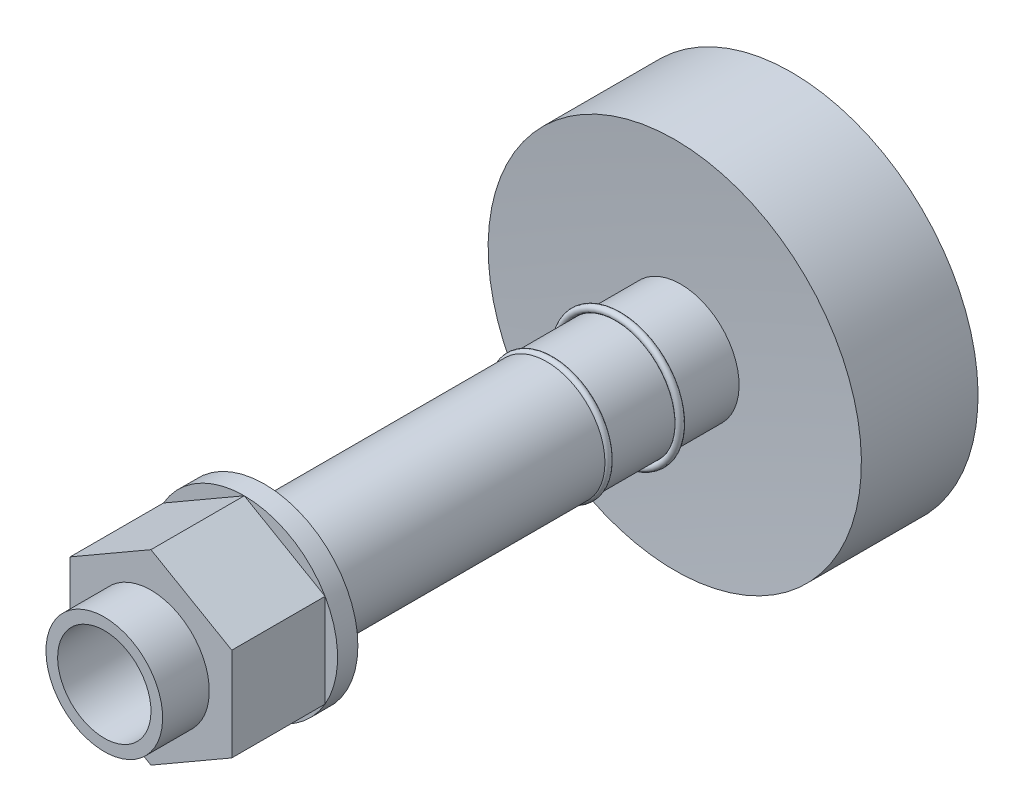
ISO-10303-21;
HEADER;
FILE_DESCRIPTION(('STEP AP214'),'2;1');
FILE_NAME('part.step','',(''),(''),'','','');
FILE_SCHEMA(('AUTOMOTIVE_DESIGN { 1 0 10303 214 1 1 1 1 }'));
ENDSEC;
DATA;
#1=APPLICATION_CONTEXT('core data for automotive mechanical design processes');
#2=APPLICATION_PROTOCOL_DEFINITION('international standard','automotive_design',2000,#1);
#3=PRODUCT_CONTEXT('',#1,'mechanical');
#4=PRODUCT('Part','Part','',(#3));
#5=PRODUCT_RELATED_PRODUCT_CATEGORY('part','',(#4));
#6=PRODUCT_DEFINITION_FORMATION('','',#4);
#7=PRODUCT_DEFINITION_CONTEXT('part definition',#1,'design');
#8=PRODUCT_DEFINITION('design','',#6,#7);
#9=PRODUCT_DEFINITION_SHAPE('','',#8);
#10=(LENGTH_UNIT() NAMED_UNIT(*) SI_UNIT(.MILLI.,.METRE.));
#11=(NAMED_UNIT(*) PLANE_ANGLE_UNIT() SI_UNIT($,.RADIAN.));
#12=(NAMED_UNIT(*) SI_UNIT($,.STERADIAN.) SOLID_ANGLE_UNIT());
#13=UNCERTAINTY_MEASURE_WITH_UNIT(LENGTH_MEASURE(1.E-05),#10,'distance_accuracy_value','');
#14=(GEOMETRIC_REPRESENTATION_CONTEXT(3) GLOBAL_UNCERTAINTY_ASSIGNED_CONTEXT((#13)) GLOBAL_UNIT_ASSIGNED_CONTEXT((#10,
#11,#12)) REPRESENTATION_CONTEXT('',''));
#15=CARTESIAN_POINT('',(0.,0.,0.));
#16=DIRECTION('',(0.,0.,1.));
#17=DIRECTION('',(1.,0.,0.));
#18=AXIS2_PLACEMENT_3D('',#15,#16,#17);
#19=CARTESIAN_POINT('',(0.,0.,92.2495455421056));
#20=DIRECTION('',(0.,0.,-1.));
#21=DIRECTION('',(-1.,0.,0.));
#22=AXIS2_PLACEMENT_3D('',#19,#20,#21);
#23=TOROIDAL_SURFACE('',#22,20.4923443192064,1.4);
#24=CARTESIAN_POINT('',(-21.8923443192064,0.,92.2495455421056));
#25=VERTEX_POINT('',#24);
#26=VERTEX_LOOP('',#25);
#27=FACE_BOUND('',#26,.T.);
#28=ADVANCED_FACE('F40',(#27),#23,.T.);
#29=CLOSED_SHELL('',(#28));
#30=MANIFOLD_SOLID_BREP('B2',#29);
#31=CARTESIAN_POINT('',(0.,0.,77.2647936935371));
#32=DIRECTION('',(0.,0.,-1.));
#33=DIRECTION('',(-1.,0.,0.));
#34=AXIS2_PLACEMENT_3D('',#31,#32,#33);
#35=TOROIDAL_SURFACE('',#34,26.5031584418758,1.4388086219481);
#36=CARTESIAN_POINT('',(-27.9419670638239,0.,77.2647936935371));
#37=VERTEX_POINT('',#36);
#38=VERTEX_LOOP('',#37);
#39=FACE_BOUND('',#38,.T.);
#40=ADVANCED_FACE('F59',(#39),#35,.T.);
#41=CLOSED_SHELL('',(#40));
#42=MANIFOLD_SOLID_BREP('B6',#41);
#43=CARTESIAN_POINT('',(0.,0.,-86.2421074818168));
#44=DIRECTION('',(0.,0.,-1.));
#45=DIRECTION('',(-1.,0.,0.));
#46=AXIS2_PLACEMENT_3D('',#43,#44,#45);
#47=TOROIDAL_SURFACE('',#46,20.4923443192064,1.4);
#48=CARTESIAN_POINT('',(-21.8923443192064,0.,-86.2421074818168));
#49=VERTEX_POINT('',#48);
#50=VERTEX_LOOP('',#49);
#51=FACE_BOUND('',#50,.T.);
#52=ADVANCED_FACE('F78',(#51),#47,.T.);
#53=CLOSED_SHELL('',(#52));
#54=MANIFOLD_SOLID_BREP('B36',#53);
#55=CARTESIAN_POINT('',(0.,0.,-72.5088813841225));
#56=DIRECTION('',(0.,0.,-1.));
#57=DIRECTION('',(-1.,0.,0.));
#58=AXIS2_PLACEMENT_3D('',#55,#56,#57);
#59=TOROIDAL_SURFACE('',#58,26.5031584418758,1.46490910367121);
#60=CARTESIAN_POINT('',(-27.968067545547,0.,-72.5088813841225));
#61=VERTEX_POINT('',#60);
#62=VERTEX_LOOP('',#61);
#63=FACE_BOUND('',#62,.T.);
#64=ADVANCED_FACE('F97',(#63),#59,.T.);
#65=CLOSED_SHELL('',(#64));
#66=MANIFOLD_SOLID_BREP('B55',#65);
#67=CARTESIAN_POINT('',(0.,0.,-43.430612264944));
#68=DIRECTION('',(0.,0.,-1.));
#69=DIRECTION('',(-1.,0.,0.));
#70=AXIS2_PLACEMENT_3D('',#67,#68,#69);
#71=TOROIDAL_SURFACE('',#70,24.5,1.5);
#72=CARTESIAN_POINT('',(-26.,0.,-43.430612264944));
#73=VERTEX_POINT('',#72);
#74=VERTEX_LOOP('',#73);
#75=FACE_BOUND('',#74,.T.);
#76=ADVANCED_FACE('F119',(#75),#71,.T.);
#77=CLOSED_SHELL('',(#76));
#78=MANIFOLD_SOLID_BREP('B74',#77);
#79=CARTESIAN_POINT('',(0.,0.,-146.850396264251));
#80=DIRECTION('',(0.,0.,-1.));
#81=DIRECTION('',(0.,1.,0.));
#82=AXIS2_PLACEMENT_3D('',#79,#80,#81);
#83=CYLINDRICAL_SURFACE('',#82,20.);
#84=CARTESIAN_POINT('',(0.,0.,147.667859857963));
#85=DIRECTION('',(0.,0.,-1.));
#86=DIRECTION('',(0.,1.,0.));
#87=AXIS2_PLACEMENT_3D('',#84,#85,#86);
#88=CIRCLE('',#87,20.);
#89=CARTESIAN_POINT('',(0.,20.,147.667859857963));
#90=VERTEX_POINT('',#89);
#91=EDGE_CURVE('E294',#90,#90,#88,.T.);
#92=ORIENTED_EDGE('',*,*,#91,.F.);
#93=EDGE_LOOP('',(#92));
#94=FACE_BOUND('',#93,.T.);
#95=CARTESIAN_POINT('',(0.,0.,93.7058594382387));
#96=DIRECTION('',(0.,0.,-1.));
#97=DIRECTION('',(-1.,0.,0.));
#98=AXIS2_PLACEMENT_3D('',#95,#96,#97);
#99=CIRCLE('',#98,20.);
#100=CARTESIAN_POINT('',(-20.,0.,93.7058594382387));
#101=VERTEX_POINT('',#100);
#102=EDGE_CURVE('E136',#101,#101,#99,.F.);
#103=ORIENTED_EDGE('',*,*,#102,.F.);
#104=EDGE_LOOP('',(#103));
#105=FACE_BOUND('',#104,.T.);
#106=ADVANCED_FACE('F132',(#94,#105),#83,.F.);
#107=CARTESIAN_POINT('',(0.,0.,-146.850396264251));
#108=DIRECTION('',(0.,0.,-1.));
#109=DIRECTION('',(0.,1.,0.));
#110=AXIS2_PLACEMENT_3D('',#107,#108,#109);
#111=CIRCLE('',#110,20.);
#112=CARTESIAN_POINT('',(0.,20.,-146.850396264251));
#113=VERTEX_POINT('',#112);
#114=EDGE_CURVE('E291',#113,#113,#111,.T.);
#115=ORIENTED_EDGE('',*,*,#114,.T.);
#116=EDGE_LOOP('',(#115));
#117=FACE_BOUND('',#116,.T.);
#118=CARTESIAN_POINT('',(0.,0.,-87.724989526654));
#119=DIRECTION('',(0.,0.,1.));
#120=DIRECTION('',(1.,0.,0.));
#121=AXIS2_PLACEMENT_3D('',#118,#119,#120);
#122=CIRCLE('',#121,20.);
#123=CARTESIAN_POINT('',(20.,0.,-87.724989526654));
#124=VERTEX_POINT('',#123);
#125=EDGE_CURVE('E232',#124,#124,#122,.F.);
#126=ORIENTED_EDGE('',*,*,#125,.F.);
#127=EDGE_LOOP('',(#126));
#128=FACE_BOUND('',#127,.T.);
#129=ADVANCED_FACE('F330',(#117,#128),#83,.F.);
#130=CARTESIAN_POINT('',(0.,0.,-146.850396264251));
#131=DIRECTION('',(0.,0.,-1.));
#132=DIRECTION('',(0.,1.,0.));
#133=AXIS2_PLACEMENT_3D('',#130,#131,#132);
#134=CYLINDRICAL_SURFACE('',#133,40.);
#135=CARTESIAN_POINT('',(0.,0.,78.9651780162435));
#136=DIRECTION('',(0.,0.,-1.));
#137=DIRECTION('',(0.,1.,0.));
#138=AXIS2_PLACEMENT_3D('',#135,#136,#137);
#139=CIRCLE('',#138,40.);
#140=CARTESIAN_POINT('',(0.,40.,78.9651780162435));
#141=VERTEX_POINT('',#140);
#142=EDGE_CURVE('E302',#141,#141,#139,.T.);
#143=ORIENTED_EDGE('',*,*,#142,.F.);
#144=EDGE_LOOP('',(#143));
#145=FACE_BOUND('',#144,.T.);
#146=CARTESIAN_POINT('',(0.,0.,87.6678598579632));
#147=DIRECTION('',(0.,0.,1.));
#148=DIRECTION('',(1.,0.,0.));
#149=AXIS2_PLACEMENT_3D('',#146,#147,#148);
#150=CIRCLE('',#149,40.);
#151=CARTESIAN_POINT('',(34.6410161513775,20.,87.6678598579632));
#152=VERTEX_POINT('',#151);
#153=CARTESIAN_POINT('',(0.,39.9999999999999,87.6678598579632));
#154=VERTEX_POINT('',#153);
#155=EDGE_CURVE('E117',#152,#154,#150,.T.);
#156=ORIENTED_EDGE('',*,*,#155,.F.);
#157=CARTESIAN_POINT('',(34.6410161513775,-19.9999999999999,87.6678598579632));
#158=VERTEX_POINT('',#157);
#159=EDGE_CURVE('E143',#158,#152,#150,.T.);
#160=ORIENTED_EDGE('',*,*,#159,.F.);
#161=CARTESIAN_POINT('',(0.,-40.,87.6678598579632));
#162=VERTEX_POINT('',#161);
#163=EDGE_CURVE('E224',#162,#158,#150,.T.);
#164=ORIENTED_EDGE('',*,*,#163,.F.);
#165=CARTESIAN_POINT('',(-34.6410161513775,-20.,87.6678598579632));
#166=VERTEX_POINT('',#165);
#167=EDGE_CURVE('E221',#166,#162,#150,.T.);
#168=ORIENTED_EDGE('',*,*,#167,.F.);
#169=CARTESIAN_POINT('',(-34.6410161513775,19.9999999999999,87.6678598579632));
#170=VERTEX_POINT('',#169);
#171=EDGE_CURVE('E220',#170,#166,#150,.T.);
#172=ORIENTED_EDGE('',*,*,#171,.F.);
#173=EDGE_CURVE('E141',#154,#170,#150,.T.);
#174=ORIENTED_EDGE('',*,*,#173,.F.);
#175=EDGE_LOOP('',(#156,#160,#164,#168,#172,#174));
#176=FACE_BOUND('',#175,.T.);
#177=ADVANCED_FACE('F218',(#145,#176),#134,.T.);
#178=CARTESIAN_POINT('',(0.,0.,127.667859857963));
#179=DIRECTION('',(0.,0.,-1.));
#180=DIRECTION('',(0.,1.,0.));
#181=AXIS2_PLACEMENT_3D('',#178,#179,#180);
#182=PLANE('',#181);
#183=CARTESIAN_POINT('',(0.,0.,127.667859857963));
#184=DIRECTION('',(0.,0.,-1.));
#185=DIRECTION('',(0.,1.,0.));
#186=AXIS2_PLACEMENT_3D('',#183,#184,#185);
#187=CIRCLE('',#186,25.);
#188=CARTESIAN_POINT('',(0.,25.,127.667859857963));
#189=VERTEX_POINT('',#188);
#190=EDGE_CURVE('E300',#189,#189,#187,.T.);
#191=ORIENTED_EDGE('',*,*,#190,.T.);
#192=EDGE_LOOP('',(#191));
#193=FACE_BOUND('',#192,.T.);
#194=DIRECTION('',(0.866025403784438,0.500000000000001,0.));
#195=VECTOR('',#194,1.);
#196=CARTESIAN_POINT('',(0.,-40.,127.667859857963));
#197=LINE('',#196,#195);
#198=CARTESIAN_POINT('',(0.,-40.,127.667859857963));
#199=VERTEX_POINT('',#198);
#200=CARTESIAN_POINT('',(34.6410161513775,-19.9999999999999,127.667859857963));
#201=VERTEX_POINT('',#200);
#202=EDGE_CURVE('E230',#199,#201,#197,.T.);
#203=ORIENTED_EDGE('',*,*,#202,.T.);
#204=DIRECTION('',(0.,1.,0.));
#205=VECTOR('',#204,1.);
#206=CARTESIAN_POINT('',(34.6410161513775,-19.9999999999999,127.667859857963));
#207=LINE('',#206,#205);
#208=CARTESIAN_POINT('',(34.6410161513775,20.0000000000001,127.667859857963));
#209=VERTEX_POINT('',#208);
#210=EDGE_CURVE('E268',#201,#209,#207,.T.);
#211=ORIENTED_EDGE('',*,*,#210,.T.);
#212=DIRECTION('',(-0.866025403784439,0.499999999999999,0.));
#213=VECTOR('',#212,1.);
#214=CARTESIAN_POINT('',(34.6410161513775,20.,127.667859857963));
#215=LINE('',#214,#213);
#216=CARTESIAN_POINT('',(0.,39.9999999999999,127.667859857963));
#217=VERTEX_POINT('',#216);
#218=EDGE_CURVE('E158',#209,#217,#215,.T.);
#219=ORIENTED_EDGE('',*,*,#218,.T.);
#220=DIRECTION('',(-0.866025403784438,-0.500000000000001,0.));
#221=VECTOR('',#220,1.);
#222=CARTESIAN_POINT('',(0.,39.9999999999999,127.667859857963));
#223=LINE('',#222,#221);
#224=CARTESIAN_POINT('',(-34.6410161513775,19.9999999999999,127.667859857963));
#225=VERTEX_POINT('',#224);
#226=EDGE_CURVE('E205',#217,#225,#223,.T.);
#227=ORIENTED_EDGE('',*,*,#226,.T.);
#228=DIRECTION('',(0.,-1.,0.));
#229=VECTOR('',#228,1.);
#230=CARTESIAN_POINT('',(-34.6410161513775,19.9999999999999,127.667859857963));
#231=LINE('',#230,#229);
#232=CARTESIAN_POINT('',(-34.6410161513775,-20.,127.667859857963));
#233=VERTEX_POINT('',#232);
#234=EDGE_CURVE('E273',#225,#233,#231,.T.);
#235=ORIENTED_EDGE('',*,*,#234,.T.);
#236=DIRECTION('',(0.866025403784439,-0.499999999999999,0.));
#237=VECTOR('',#236,1.);
#238=CARTESIAN_POINT('',(-34.6410161513775,-20.,127.667859857963));
#239=LINE('',#238,#237);
#240=EDGE_CURVE('E258',#233,#199,#239,.T.);
#241=ORIENTED_EDGE('',*,*,#240,.T.);
#242=EDGE_LOOP('',(#203,#211,#219,#227,#235,#241));
#243=FACE_BOUND('',#242,.T.);
#244=ADVANCED_FACE('F322',(#193,#243),#182,.F.);
#245=CARTESIAN_POINT('',(0.,0.,1020.28880723726));
#246=DIRECTION('',(0.,0.,-1.));
#247=DIRECTION('',(0.,1.,0.));
#248=AXIS2_PLACEMENT_3D('',#245,#246,#247);
#249=SPHERICAL_SURFACE('',#248,1120.);
#250=CARTESIAN_POINT('',(0.,0.,-96.8503962642506));
#251=DIRECTION('',(0.,0.,-1.));
#252=DIRECTION('',(0.,1.,0.));
#253=AXIS2_PLACEMENT_3D('',#250,#251,#252);
#254=CIRCLE('',#253,80.);
#255=CARTESIAN_POINT('',(0.,80.0000000000026,-96.8503962642506));
#256=VERTEX_POINT('',#255);
#257=EDGE_CURVE('E280',#256,#256,#254,.T.);
#258=CARTESIAN_POINT('',(0.,0.,-99.4321401420368));
#259=DIRECTION('',(0.,0.,-1.));
#260=DIRECTION('',(0.,1.,0.));
#261=AXIS2_PLACEMENT_3D('',#258,#259,#260);
#262=CIRCLE('',#261,25.);
#263=CARTESIAN_POINT('',(0.,24.9999999999982,-99.4321401420368));
#264=VERTEX_POINT('',#263);
#265=EDGE_CURVE('E225',#264,#264,#262,.T.);
#266=CARTESIAN_POINT('',(0.,80.0000000000026,-96.8503962642506));
#267=CARTESIAN_POINT('',(0.,79.427859864808,-96.8913680707098));
#268=CARTESIAN_POINT('',(0.,78.8556882541452,-96.931900346162));
#269=CARTESIAN_POINT('',(0.,77.7112834326982,-97.0120857410063));
#270=CARTESIAN_POINT('',(0.,77.139050221914,-97.0517388603985));
#271=CARTESIAN_POINT('',(0.,75.9945235510389,-97.1301658490768));
#272=CARTESIAN_POINT('',(0.,75.422230090948,-97.168939718363));
#273=CARTESIAN_POINT('',(0.,74.277584272456,-97.245608115415));
#274=CARTESIAN_POINT('',(0.,73.7052319140548,-97.2835026431808));
#275=CARTESIAN_POINT('',(0.,72.5604696500667,-97.3584122677048));
#276=CARTESIAN_POINT('',(0.,71.9880597444798,-97.3954273644631));
#277=CARTESIAN_POINT('',(0.,70.8431837373836,-97.4685780396003));
#278=CARTESIAN_POINT('',(0.,70.2707176358743,-97.5047136179792));
#279=CARTESIAN_POINT('',(0.,69.1257305883287,-97.576105171052));
#280=CARTESIAN_POINT('',(0.,68.5532096422922,-97.6113611457458));
#281=CARTESIAN_POINT('',(0.,67.4081142572172,-97.6809934082219));
#282=CARTESIAN_POINT('',(0.,66.8355398181785,-97.7153696960042));
#283=CARTESIAN_POINT('',(0.,65.6903387987503,-97.7832425035062));
#284=CARTESIAN_POINT('',(0.,65.1177122183607,-97.8167390232259));
#285=CARTESIAN_POINT('',(0.,63.9724082680047,-97.8828522155293));
#286=CARTESIAN_POINT('',(0.,63.3997308980383,-97.9154688881129));
#287=CARTESIAN_POINT('',(0.,62.254326720423,-97.9798223091473));
#288=CARTESIAN_POINT('',(0.,61.681599912774,-98.0115590575981));
#289=CARTESIAN_POINT('',(0.,60.5360982118043,-98.0741525554469));
#290=CARTESIAN_POINT('',(0.,59.9633233184835,-98.1050093048451));
#291=CARTESIAN_POINT('',(0.,58.8177267982946,-98.165842731747));
#292=CARTESIAN_POINT('',(0.,58.2449051714265,-98.1958194092508));
#293=CARTESIAN_POINT('',(0.,57.0992165363774,-98.254892621599));
#294=CARTESIAN_POINT('',(0.,56.5263495281965,-98.2839891564434));
#295=CARTESIAN_POINT('',(0.,55.3805714828638,-98.341302014786));
#296=CARTESIAN_POINT('',(0.,54.8076604457121,-98.3695183382844));
#297=CARTESIAN_POINT('',(0.,53.6617956948836,-98.4250707073258));
#298=CARTESIAN_POINT('',(0.,53.0888419812067,-98.452406752869));
#299=CARTESIAN_POINT('',(0.,51.9428932298744,-98.5061985014692));
#300=CARTESIAN_POINT('',(0.,51.3698981922189,-98.5326542045262));
#301=CARTESIAN_POINT('',(0.,50.2238681455735,-98.5846852057012));
#302=CARTESIAN_POINT('',(0.,49.6508331365834,-98.6102605038192));
#303=CARTESIAN_POINT('',(0.,48.5047245000072,-98.6605306347418));
#304=CARTESIAN_POINT('',(0.,47.9316508724209,-98.6852254675465));
#305=CARTESIAN_POINT('',(0.,46.7854663514819,-98.7337346095463));
#306=CARTESIAN_POINT('',(0.,46.2123554581292,-98.7575489187414));
#307=CARTESIAN_POINT('',(0.,45.0660977585747,-98.804296957305));
#308=CARTESIAN_POINT('',(0.,44.4929509523729,-98.8272306866735));
#309=CARTESIAN_POINT('',(0.,43.3466227801227,-98.8722175114448));
#310=CARTESIAN_POINT('',(0.,42.7734414140742,-98.8942706068476));
#311=CARTESIAN_POINT('',(0.,41.6270454752145,-98.9374961116281));
#312=CARTESIAN_POINT('',(0.,41.0538309024033,-98.9586685210058));
#313=CARTESIAN_POINT('',(0.,39.9073699031803,-99.0001326037552));
#314=CARTESIAN_POINT('',(0.,39.3341234767686,-99.0204242771268));
#315=CARTESIAN_POINT('',(0.,38.1876001235821,-99.0601268399625));
#316=CARTESIAN_POINT('',(0.,37.6143231968074,-99.0795377294266));
#317=CARTESIAN_POINT('',(0.,36.4677401962044,-99.1174786786247));
#318=CARTESIAN_POINT('',(0.,35.8944341223762,-99.1360087383587));
#319=CARTESIAN_POINT('',(0.,34.7477941810447,-99.1721879843531));
#320=CARTESIAN_POINT('',(0.,34.1744603135413,-99.1898371706136));
#321=CARTESIAN_POINT('',(0.,33.0277661383034,-99.2242546279992));
#322=CARTESIAN_POINT('',(0.,32.4544058305688,-99.2410228991245));
#323=CARTESIAN_POINT('',(0.,31.3076601283745,-99.2736784866475));
#324=CARTESIAN_POINT('',(0.,30.7342747339149,-99.2895658030453));
#325=CARTESIAN_POINT('',(0.,29.5874802118366,-99.3204594436403));
#326=CARTESIAN_POINT('',(0.,29.0140710842181,-99.3354657678376));
#327=CARTESIAN_POINT('',(0.,27.8672304494411,-99.3645973884889));
#328=CARTESIAN_POINT('',(0.,27.2937989422826,-99.3787226849428));
#329=CARTESIAN_POINT('',(0.,26.1469149021105,-99.4060922172024));
#330=CARTESIAN_POINT('',(0.,25.5734623690969,-99.4193364530079));
#331=CARTESIAN_POINT('',(0.,24.9999999999982,-99.4321401420368));
#332=B_SPLINE_CURVE_WITH_KNOTS('',3,(#266,#267,#268,#269,#270,#271,#272,#273,#274,#275,#276,
#277,#278,#279,#280,#281,#282,#283,#284,#285,#286,#287,#288,#289,#290,#291,#292,#293,#294,#295,
#296,#297,#298,#299,#300,#301,#302,#303,#304,#305,#306,#307,#308,#309,#310,#311,#312,#313,#314,
#315,#316,#317,#318,#319,#320,#321,#322,#323,#324,#325,#326,#327,#328,#329,#330,#331),
.UNSPECIFIED.,.F.,.F.,(4,2,2,2,2,2,2,2,2,2,2,2,2,2,2,2,2,2,2,2,2,2,2,2,2,2,2,2,2,2,2,2,4),(0.,
1.72081568637867,3.44163137275737,5.16244705913633,6.88326274551501,8.60407843189372,
10.3248941182724,12.0457098046511,13.76652549103,15.4873411774087,17.2081568637874,
18.9289725501661,20.6497882365448,22.3706039229235,24.0914196093025,25.8122352956812,
27.5330509820599,29.2538666684386,30.9746823548172,32.6954980411962,34.4163137275749,
36.1371294139536,37.8579451003323,39.578760786711,41.2995764730897,43.0203921594686,
44.7412078458473,46.462023532226,48.1828392186047,49.9036549049834,51.6244705913623,
53.345286277741,55.0661019641197),.UNSPECIFIED.);
#333=EDGE_CURVE('BSEAM134',#256,#264,#332,.T.);
#334=ORIENTED_EDGE('',*,*,#257,.F.);
#335=ORIENTED_EDGE('',*,*,#265,.T.);
#336=ORIENTED_EDGE('',*,*,#333,.T.);
#337=ORIENTED_EDGE('',*,*,#333,.F.);
#338=EDGE_LOOP('',(#334,#336,#335,#337));
#339=FACE_BOUND('',#338,.T.);
#340=ADVANCED_FACE('F134',(#339),#249,.F.);
#341=CARTESIAN_POINT('',(0.,0.,-146.850396264251));
#342=DIRECTION('',(0.,0.,-1.));
#343=DIRECTION('',(0.,1.,0.));
#344=AXIS2_PLACEMENT_3D('',#341,#342,#343);
#345=CYLINDRICAL_SURFACE('',#344,25.);
#346=CARTESIAN_POINT('',(0.,0.,-44.930612264944));
#347=DIRECTION('',(0.,0.,1.));
#348=DIRECTION('',(1.,0.,0.));
#349=AXIS2_PLACEMENT_3D('',#346,#347,#348);
#350=CIRCLE('',#349,25.);
#351=CARTESIAN_POINT('',(25.,0.,-44.930612264944));
#352=VERTEX_POINT('',#351);
#353=EDGE_CURVE('E252',#352,#352,#350,.T.);
#354=ORIENTED_EDGE('',*,*,#353,.F.);
#355=EDGE_LOOP('',(#354));
#356=FACE_BOUND('',#355,.T.);
#357=ORIENTED_EDGE('',*,*,#265,.F.);
#358=EDGE_LOOP('',(#357));
#359=FACE_BOUND('',#358,.T.);
#360=ADVANCED_FACE('F310',(#356,#359),#345,.T.);
#361=CARTESIAN_POINT('',(0.,0.,1017.67972247987));
#362=DIRECTION('',(0.,0.,-1.));
#363=DIRECTION('',(0.,1.,0.));
#364=AXIS2_PLACEMENT_3D('',#361,#362,#363);
#365=DEGENERATE_TOROIDAL_SURFACE('',#364,48.7435294117576,942.9,.F.);
#366=CARTESIAN_POINT('',(0.,0.,77.9080264316032));
#367=DIRECTION('',(0.,0.,1.));
#368=DIRECTION('',(0.,-1.,0.));
#369=AXIS2_PLACEMENT_3D('',#366,#367,#368);
#370=CIRCLE('',#369,28.);
#371=CARTESIAN_POINT('',(0.,-28.,77.9080264316032));
#372=VERTEX_POINT('',#371);
#373=EDGE_CURVE('E227',#372,#372,#370,.F.);
#374=ORIENTED_EDGE('',*,*,#373,.F.);
#375=EDGE_LOOP('',(#374));
#376=FACE_BOUND('',#375,.T.);
#377=ORIENTED_EDGE('',*,*,#142,.T.);
#378=EDGE_LOOP('',(#377));
#379=FACE_BOUND('',#378,.T.);
#380=ADVANCED_FACE('F312',(#376,#379),#365,.F.);
#381=CARTESIAN_POINT('',(0.,0.,-146.850396264251));
#382=DIRECTION('',(0.,0.,-1.));
#383=DIRECTION('',(0.,1.,0.));
#384=AXIS2_PLACEMENT_3D('',#381,#382,#383);
#385=CYLINDRICAL_SURFACE('',#384,25.);
#386=CARTESIAN_POINT('',(0.,0.,147.667859857963));
#387=DIRECTION('',(0.,0.,-1.));
#388=DIRECTION('',(0.,1.,0.));
#389=AXIS2_PLACEMENT_3D('',#386,#387,#388);
#390=CIRCLE('',#389,25.);
#391=CARTESIAN_POINT('',(0.,25.,147.667859857963));
#392=VERTEX_POINT('',#391);
#393=EDGE_CURVE('E297',#392,#392,#390,.T.);
#394=ORIENTED_EDGE('',*,*,#393,.T.);
#395=EDGE_LOOP('',(#394));
#396=FACE_BOUND('',#395,.T.);
#397=ORIENTED_EDGE('',*,*,#190,.F.);
#398=EDGE_LOOP('',(#397));
#399=FACE_BOUND('',#398,.T.);
#400=ADVANCED_FACE('F319',(#396,#399),#385,.T.);
#401=CARTESIAN_POINT('',(0.,0.,147.667859857963));
#402=DIRECTION('',(0.,0.,1.));
#403=DIRECTION('',(0.,-1.,0.));
#404=AXIS2_PLACEMENT_3D('',#401,#402,#403);
#405=PLANE('',#404);
#406=ORIENTED_EDGE('',*,*,#91,.T.);
#407=EDGE_LOOP('',(#406));
#408=FACE_BOUND('',#407,.T.);
#409=ORIENTED_EDGE('',*,*,#393,.F.);
#410=EDGE_LOOP('',(#409));
#411=FACE_BOUND('',#410,.T.);
#412=ADVANCED_FACE('F415',(#408,#411),#405,.T.);
#413=CARTESIAN_POINT('',(0.,1.35863909256583E-13,-146.850396264251));
#414=DIRECTION('',(0.,0.,1.));
#415=DIRECTION('',(0.,-1.,0.));
#416=AXIS2_PLACEMENT_3D('',#413,#414,#415);
#417=PLANE('',#416);
#418=ORIENTED_EDGE('',*,*,#114,.F.);
#419=EDGE_LOOP('',(#418));
#420=FACE_BOUND('',#419,.T.);
#421=CARTESIAN_POINT('',(0.,0.,-146.850396264251));
#422=DIRECTION('',(0.,0.,-1.));
#423=DIRECTION('',(0.,1.,0.));
#424=AXIS2_PLACEMENT_3D('',#421,#422,#423);
#425=CIRCLE('',#424,80.);
#426=CARTESIAN_POINT('',(0.,80.,-146.850396264251));
#427=VERTEX_POINT('',#426);
#428=EDGE_CURVE('E288',#427,#427,#425,.T.);
#429=ORIENTED_EDGE('',*,*,#428,.T.);
#430=EDGE_LOOP('',(#429));
#431=FACE_BOUND('',#430,.T.);
#432=ADVANCED_FACE('F412',(#420,#431),#417,.F.);
#433=CARTESIAN_POINT('',(0.,0.,-146.850396264251));
#434=DIRECTION('',(0.,0.,-1.));
#435=DIRECTION('',(0.,1.,0.));
#436=AXIS2_PLACEMENT_3D('',#433,#434,#435);
#437=CYLINDRICAL_SURFACE('',#436,80.);
#438=ORIENTED_EDGE('',*,*,#428,.F.);
#439=EDGE_LOOP('',(#438));
#440=FACE_BOUND('',#439,.T.);
#441=ORIENTED_EDGE('',*,*,#257,.T.);
#442=EDGE_LOOP('',(#441));
#443=FACE_BOUND('',#442,.T.);
#444=ADVANCED_FACE('F410',(#440,#443),#437,.T.);
#445=CARTESIAN_POINT('',(0.,0.,87.6678598579632));
#446=DIRECTION('',(0.,0.,1.));
#447=DIRECTION('',(1.,0.,0.));
#448=AXIS2_PLACEMENT_3D('',#445,#446,#447);
#449=PLANE('',#448);
#450=ORIENTED_EDGE('',*,*,#155,.T.);
#451=DIRECTION('',(-0.866025403784439,0.499999999999999,0.));
#452=VECTOR('',#451,1.);
#453=CARTESIAN_POINT('',(34.6410161513775,20.,87.6678598579632));
#454=LINE('',#453,#452);
#455=EDGE_CURVE('E192',#152,#154,#454,.T.);
#456=ORIENTED_EDGE('',*,*,#455,.F.);
#457=EDGE_LOOP('',(#450,#456));
#458=FACE_BOUND('',#457,.T.);
#459=ADVANCED_FACE('F190',(#458),#449,.T.);
#460=ORIENTED_EDGE('',*,*,#173,.T.);
#461=DIRECTION('',(-0.866025403784438,-0.500000000000001,0.));
#462=VECTOR('',#461,1.);
#463=CARTESIAN_POINT('',(0.,39.9999999999999,87.6678598579632));
#464=LINE('',#463,#462);
#465=EDGE_CURVE('E202',#154,#170,#464,.T.);
#466=ORIENTED_EDGE('',*,*,#465,.F.);
#467=EDGE_LOOP('',(#460,#466));
#468=FACE_BOUND('',#467,.T.);
#469=ADVANCED_FACE('F210',(#468),#449,.T.);
#470=ORIENTED_EDGE('',*,*,#171,.T.);
#471=DIRECTION('',(0.,-1.,0.));
#472=VECTOR('',#471,1.);
#473=CARTESIAN_POINT('',(-34.6410161513775,19.9999999999999,87.6678598579632));
#474=LINE('',#473,#472);
#475=EDGE_CURVE('E212',#170,#166,#474,.T.);
#476=ORIENTED_EDGE('',*,*,#475,.F.);
#477=EDGE_LOOP('',(#470,#476));
#478=FACE_BOUND('',#477,.T.);
#479=ADVANCED_FACE('F487',(#478),#449,.T.);
#480=ORIENTED_EDGE('',*,*,#167,.T.);
#481=DIRECTION('',(0.866025403784439,-0.499999999999999,0.));
#482=VECTOR('',#481,1.);
#483=CARTESIAN_POINT('',(-34.6410161513775,-20.,87.6678598579632));
#484=LINE('',#483,#482);
#485=EDGE_CURVE('E262',#166,#162,#484,.T.);
#486=ORIENTED_EDGE('',*,*,#485,.F.);
#487=EDGE_LOOP('',(#480,#486));
#488=FACE_BOUND('',#487,.T.);
#489=ADVANCED_FACE('F493',(#488),#449,.T.);
#490=ORIENTED_EDGE('',*,*,#163,.T.);
#491=DIRECTION('',(0.866025403784438,0.500000000000001,0.));
#492=VECTOR('',#491,1.);
#493=CARTESIAN_POINT('',(0.,-40.,87.6678598579632));
#494=LINE('',#493,#492);
#495=EDGE_CURVE('E150',#162,#158,#494,.T.);
#496=ORIENTED_EDGE('',*,*,#495,.F.);
#497=EDGE_LOOP('',(#490,#496));
#498=FACE_BOUND('',#497,.T.);
#499=ADVANCED_FACE('F500',(#498),#449,.T.);
#500=ORIENTED_EDGE('',*,*,#159,.T.);
#501=DIRECTION('',(0.,1.,0.));
#502=VECTOR('',#501,1.);
#503=CARTESIAN_POINT('',(34.6410161513775,-19.9999999999999,87.6678598579632));
#504=LINE('',#503,#502);
#505=EDGE_CURVE('E216',#158,#152,#504,.T.);
#506=ORIENTED_EDGE('',*,*,#505,.F.);
#507=EDGE_LOOP('',(#500,#506));
#508=FACE_BOUND('',#507,.T.);
#509=ADVANCED_FACE('F407',(#508),#449,.T.);
#510=CARTESIAN_POINT('',(0.,-40.,87.6678598579632));
#511=DIRECTION('',(0.500000000000001,-0.866025403784438,0.));
#512=DIRECTION('',(0.866025403784438,0.500000000000001,0.));
#513=AXIS2_PLACEMENT_3D('',#510,#511,#512);
#514=PLANE('',#513);
#515=ORIENTED_EDGE('',*,*,#202,.F.);
#516=DIRECTION('',(0.,0.,1.));
#517=VECTOR('',#516,1.);
#518=CARTESIAN_POINT('',(0.,-40.,87.6678598579632));
#519=LINE('',#518,#517);
#520=EDGE_CURVE('E278',#162,#199,#519,.T.);
#521=ORIENTED_EDGE('',*,*,#520,.F.);
#522=ORIENTED_EDGE('',*,*,#495,.T.);
#523=DIRECTION('',(0.,0.,1.));
#524=VECTOR('',#523,1.);
#525=CARTESIAN_POINT('',(34.6410161513775,-19.9999999999999,87.6678598579632));
#526=LINE('',#525,#524);
#527=EDGE_CURVE('E265',#158,#201,#526,.T.);
#528=ORIENTED_EDGE('',*,*,#527,.T.);
#529=EDGE_LOOP('',(#515,#521,#522,#528));
#530=FACE_BOUND('',#529,.T.);
#531=ADVANCED_FACE('F393',(#530),#514,.T.);
#532=CARTESIAN_POINT('',(-34.6410161513775,-20.,87.6678598579632));
#533=DIRECTION('',(-0.499999999999999,-0.866025403784439,0.));
#534=DIRECTION('',(0.866025403784439,-0.499999999999999,0.));
#535=AXIS2_PLACEMENT_3D('',#532,#533,#534);
#536=PLANE('',#535);
#537=ORIENTED_EDGE('',*,*,#240,.F.);
#538=DIRECTION('',(0.,0.,1.));
#539=VECTOR('',#538,1.);
#540=CARTESIAN_POINT('',(-34.6410161513775,-20.,87.6678598579632));
#541=LINE('',#540,#539);
#542=EDGE_CURVE('E281',#166,#233,#541,.T.);
#543=ORIENTED_EDGE('',*,*,#542,.F.);
#544=ORIENTED_EDGE('',*,*,#485,.T.);
#545=ORIENTED_EDGE('',*,*,#520,.T.);
#546=EDGE_LOOP('',(#537,#543,#544,#545));
#547=FACE_BOUND('',#546,.T.);
#548=ADVANCED_FACE('F389',(#547),#536,.T.);
#549=CARTESIAN_POINT('',(-34.6410161513775,19.9999999999999,87.6678598579632));
#550=DIRECTION('',(-1.,0.,0.));
#551=DIRECTION('',(0.,-1.,0.));
#552=AXIS2_PLACEMENT_3D('',#549,#550,#551);
#553=PLANE('',#552);
#554=ORIENTED_EDGE('',*,*,#234,.F.);
#555=DIRECTION('',(0.,0.,1.));
#556=VECTOR('',#555,1.);
#557=CARTESIAN_POINT('',(-34.6410161513775,19.9999999999999,87.6678598579632));
#558=LINE('',#557,#556);
#559=EDGE_CURVE('E206',#170,#225,#558,.T.);
#560=ORIENTED_EDGE('',*,*,#559,.F.);
#561=ORIENTED_EDGE('',*,*,#475,.T.);
#562=ORIENTED_EDGE('',*,*,#542,.T.);
#563=EDGE_LOOP('',(#554,#560,#561,#562));
#564=FACE_BOUND('',#563,.T.);
#565=ADVANCED_FACE('F392',(#564),#553,.T.);
#566=CARTESIAN_POINT('',(0.,39.9999999999999,87.6678598579632));
#567=DIRECTION('',(-0.500000000000001,0.866025403784438,0.));
#568=DIRECTION('',(-0.866025403784438,-0.500000000000001,0.));
#569=AXIS2_PLACEMENT_3D('',#566,#567,#568);
#570=PLANE('',#569);
#571=ORIENTED_EDGE('',*,*,#226,.F.);
#572=DIRECTION('',(0.,0.,1.));
#573=VECTOR('',#572,1.);
#574=CARTESIAN_POINT('',(0.,39.9999999999999,87.6678598579632));
#575=LINE('',#574,#573);
#576=EDGE_CURVE('E199',#154,#217,#575,.T.);
#577=ORIENTED_EDGE('',*,*,#576,.F.);
#578=ORIENTED_EDGE('',*,*,#465,.T.);
#579=ORIENTED_EDGE('',*,*,#559,.T.);
#580=EDGE_LOOP('',(#571,#577,#578,#579));
#581=FACE_BOUND('',#580,.T.);
#582=ADVANCED_FACE('F201',(#581),#570,.T.);
#583=CARTESIAN_POINT('',(34.6410161513775,20.,87.6678598579632));
#584=DIRECTION('',(0.499999999999999,0.866025403784439,0.));
#585=DIRECTION('',(-0.866025403784439,0.499999999999999,0.));
#586=AXIS2_PLACEMENT_3D('',#583,#584,#585);
#587=PLANE('',#586);
#588=ORIENTED_EDGE('',*,*,#218,.F.);
#589=DIRECTION('',(0.,0.,1.));
#590=VECTOR('',#589,1.);
#591=CARTESIAN_POINT('',(34.6410161513775,20.,87.6678598579632));
#592=LINE('',#591,#590);
#593=EDGE_CURVE('E207',#152,#209,#592,.T.);
#594=ORIENTED_EDGE('',*,*,#593,.F.);
#595=ORIENTED_EDGE('',*,*,#455,.T.);
#596=ORIENTED_EDGE('',*,*,#576,.T.);
#597=EDGE_LOOP('',(#588,#594,#595,#596));
#598=FACE_BOUND('',#597,.T.);
#599=ADVANCED_FACE('F214',(#598),#587,.T.);
#600=CARTESIAN_POINT('',(34.6410161513775,-19.9999999999999,87.6678598579632));
#601=DIRECTION('',(1.,0.,0.));
#602=DIRECTION('',(0.,1.,0.));
#603=AXIS2_PLACEMENT_3D('',#600,#601,#602);
#604=PLANE('',#603);
#605=ORIENTED_EDGE('',*,*,#210,.F.);
#606=ORIENTED_EDGE('',*,*,#527,.F.);
#607=ORIENTED_EDGE('',*,*,#505,.T.);
#608=ORIENTED_EDGE('',*,*,#593,.T.);
#609=EDGE_LOOP('',(#605,#606,#607,#608));
#610=FACE_BOUND('',#609,.T.);
#611=ADVANCED_FACE('F387',(#610),#604,.T.);
#612=CARTESIAN_POINT('',(25.,0.,79.6678598579632));
#613=DIRECTION('',(0.,0.,1.));
#614=DIRECTION('',(1.,0.,0.));
#615=AXIS2_PLACEMENT_3D('',#612,#613,#614);
#616=PLANE('',#615);
#617=CARTESIAN_POINT('',(0.,0.,79.6678598579632));
#618=DIRECTION('',(0.,0.,1.));
#619=DIRECTION('',(1.,0.,0.));
#620=AXIS2_PLACEMENT_3D('',#617,#618,#619);
#621=CIRCLE('',#620,28.);
#622=CARTESIAN_POINT('',(28.,0.,79.6678598579632));
#623=VERTEX_POINT('',#622);
#624=EDGE_CURVE('E243',#623,#623,#621,.T.);
#625=ORIENTED_EDGE('',*,*,#624,.F.);
#626=EDGE_LOOP('',(#625));
#627=FACE_BOUND('',#626,.T.);
#628=CARTESIAN_POINT('',(0.,0.,79.6678598579632));
#629=DIRECTION('',(0.,0.,1.));
#630=DIRECTION('',(1.,0.,0.));
#631=AXIS2_PLACEMENT_3D('',#628,#629,#630);
#632=CIRCLE('',#631,25.);
#633=CARTESIAN_POINT('',(25.,0.,79.6678598579632));
#634=VERTEX_POINT('',#633);
#635=EDGE_CURVE('E247',#634,#634,#632,.T.);
#636=ORIENTED_EDGE('',*,*,#635,.T.);
#637=EDGE_LOOP('',(#636));
#638=FACE_BOUND('',#637,.T.);
#639=ADVANCED_FACE('F383',(#627,#638),#616,.F.);
#640=CARTESIAN_POINT('',(0.,0.,0.));
#641=DIRECTION('',(0.,0.,1.));
#642=DIRECTION('',(1.,0.,0.));
#643=AXIS2_PLACEMENT_3D('',#640,#641,#642);
#644=CYLINDRICAL_SURFACE('',#643,28.);
#645=ORIENTED_EDGE('',*,*,#373,.T.);
#646=EDGE_LOOP('',(#645));
#647=FACE_BOUND('',#646,.T.);
#648=ORIENTED_EDGE('',*,*,#624,.T.);
#649=EDGE_LOOP('',(#648));
#650=FACE_BOUND('',#649,.T.);
#651=ADVANCED_FACE('F379',(#647,#650),#644,.F.);
#652=CARTESIAN_POINT('',(25.,0.,-41.930612264944));
#653=DIRECTION('',(0.,0.,1.));
#654=DIRECTION('',(1.,0.,0.));
#655=AXIS2_PLACEMENT_3D('',#652,#653,#654);
#656=PLANE('',#655);
#657=CARTESIAN_POINT('',(0.,0.,-41.930612264944));
#658=DIRECTION('',(0.,0.,1.));
#659=DIRECTION('',(1.,0.,0.));
#660=AXIS2_PLACEMENT_3D('',#657,#658,#659);
#661=CIRCLE('',#660,25.);
#662=CARTESIAN_POINT('',(25.,0.,-41.930612264944));
#663=VERTEX_POINT('',#662);
#664=EDGE_CURVE('E231',#663,#663,#661,.T.);
#665=ORIENTED_EDGE('',*,*,#664,.F.);
#666=EDGE_LOOP('',(#665));
#667=FACE_BOUND('',#666,.T.);
#668=CARTESIAN_POINT('',(0.,0.,-41.930612264944));
#669=DIRECTION('',(0.,0.,1.));
#670=DIRECTION('',(1.,0.,0.));
#671=AXIS2_PLACEMENT_3D('',#668,#669,#670);
#672=CIRCLE('',#671,23.);
#673=CARTESIAN_POINT('',(23.,0.,-41.930612264944));
#674=VERTEX_POINT('',#673);
#675=EDGE_CURVE('E641',#674,#674,#672,.T.);
#676=ORIENTED_EDGE('',*,*,#675,.T.);
#677=EDGE_LOOP('',(#676));
#678=FACE_BOUND('',#677,.T.);
#679=ADVANCED_FACE('F375',(#667,#678),#656,.F.);
#680=CARTESIAN_POINT('',(0.,0.,0.));
#681=DIRECTION('',(0.,0.,1.));
#682=DIRECTION('',(1.,0.,0.));
#683=AXIS2_PLACEMENT_3D('',#680,#681,#682);
#684=CYLINDRICAL_SURFACE('',#683,23.);
#685=ORIENTED_EDGE('',*,*,#675,.F.);
#686=EDGE_LOOP('',(#685));
#687=FACE_BOUND('',#686,.T.);
#688=CARTESIAN_POINT('',(0.,0.,-44.930612264944));
#689=DIRECTION('',(0.,0.,1.));
#690=DIRECTION('',(1.,0.,0.));
#691=AXIS2_PLACEMENT_3D('',#688,#689,#690);
#692=CIRCLE('',#691,23.);
#693=CARTESIAN_POINT('',(23.,0.,-44.930612264944));
#694=VERTEX_POINT('',#693);
#695=EDGE_CURVE('E639',#694,#694,#692,.T.);
#696=ORIENTED_EDGE('',*,*,#695,.T.);
#697=EDGE_LOOP('',(#696));
#698=FACE_BOUND('',#697,.T.);
#699=ADVANCED_FACE('F371',(#687,#698),#684,.T.);
#700=CARTESIAN_POINT('',(25.,0.,-44.930612264944));
#701=DIRECTION('',(0.,0.,-1.));
#702=DIRECTION('',(-1.,0.,0.));
#703=AXIS2_PLACEMENT_3D('',#700,#701,#702);
#704=PLANE('',#703);
#705=ORIENTED_EDGE('',*,*,#353,.T.);
#706=EDGE_LOOP('',(#705));
#707=FACE_BOUND('',#706,.T.);
#708=ORIENTED_EDGE('',*,*,#695,.F.);
#709=EDGE_LOOP('',(#708));
#710=FACE_BOUND('',#709,.T.);
#711=ADVANCED_FACE('F327',(#707,#710),#704,.F.);
#712=ORIENTED_EDGE('',*,*,#664,.T.);
#713=EDGE_LOOP('',(#712));
#714=FACE_BOUND('',#713,.T.);
#715=ORIENTED_EDGE('',*,*,#635,.F.);
#716=EDGE_LOOP('',(#715));
#717=FACE_BOUND('',#716,.T.);
#718=ADVANCED_FACE('F314',(#714,#717),#345,.T.);
#719=CARTESIAN_POINT('',(19.9987545408177,0.,-84.724989526654));
#720=DIRECTION('',(0.,0.,-1.));
#721=DIRECTION('',(-1.,0.,0.));
#722=AXIS2_PLACEMENT_3D('',#719,#720,#721);
#723=PLANE('',#722);
#724=CARTESIAN_POINT('',(0.,0.,-84.724989526654));
#725=DIRECTION('',(0.,0.,-1.));
#726=DIRECTION('',(-1.,0.,0.));
#727=AXIS2_PLACEMENT_3D('',#724,#725,#726);
#728=CIRCLE('',#727,21.9987545408177);
#729=CARTESIAN_POINT('',(-21.9987545408177,0.,-84.724989526654));
#730=VERTEX_POINT('',#729);
#731=EDGE_CURVE('E630',#730,#730,#728,.T.);
#732=ORIENTED_EDGE('',*,*,#731,.T.);
#733=EDGE_LOOP('',(#732));
#734=FACE_BOUND('',#733,.T.);
#735=CARTESIAN_POINT('',(0.,0.,-84.724989526654));
#736=DIRECTION('',(0.,0.,-1.));
#737=DIRECTION('',(-1.,0.,0.));
#738=AXIS2_PLACEMENT_3D('',#735,#736,#737);
#739=CIRCLE('',#738,20.);
#740=CARTESIAN_POINT('',(-20.,0.,-84.724989526654));
#741=VERTEX_POINT('',#740);
#742=EDGE_CURVE('E235',#741,#741,#739,.F.);
#743=ORIENTED_EDGE('',*,*,#742,.T.);
#744=EDGE_LOOP('',(#743));
#745=FACE_BOUND('',#744,.T.);
#746=ADVANCED_FACE('F326',(#734,#745),#723,.T.);
#747=CARTESIAN_POINT('',(19.9987545408177,0.,-87.724989526654));
#748=DIRECTION('',(0.,0.,1.));
#749=DIRECTION('',(1.,0.,0.));
#750=AXIS2_PLACEMENT_3D('',#747,#748,#749);
#751=PLANE('',#750);
#752=CARTESIAN_POINT('',(0.,0.,-87.724989526654));
#753=DIRECTION('',(0.,0.,-1.));
#754=DIRECTION('',(-1.,0.,0.));
#755=AXIS2_PLACEMENT_3D('',#752,#753,#754);
#756=CIRCLE('',#755,21.9987545408177);
#757=CARTESIAN_POINT('',(-21.9987545408177,0.,-87.724989526654));
#758=VERTEX_POINT('',#757);
#759=EDGE_CURVE('E633',#758,#758,#756,.T.);
#760=ORIENTED_EDGE('',*,*,#759,.F.);
#761=EDGE_LOOP('',(#760));
#762=FACE_BOUND('',#761,.T.);
#763=ORIENTED_EDGE('',*,*,#125,.T.);
#764=EDGE_LOOP('',(#763));
#765=FACE_BOUND('',#764,.T.);
#766=ADVANCED_FACE('F353',(#762,#765),#751,.T.);
#767=CARTESIAN_POINT('',(0.,0.,-154.641449096205));
#768=DIRECTION('',(0.,0.,-1.));
#769=DIRECTION('',(-1.,0.,0.));
#770=AXIS2_PLACEMENT_3D('',#767,#768,#769);
#771=CYLINDRICAL_SURFACE('',#770,21.9987545408177);
#772=ORIENTED_EDGE('',*,*,#759,.T.);
#773=EDGE_LOOP('',(#772));
#774=FACE_BOUND('',#773,.T.);
#775=ORIENTED_EDGE('',*,*,#731,.F.);
#776=EDGE_LOOP('',(#775));
#777=FACE_BOUND('',#776,.T.);
#778=ADVANCED_FACE('F344',(#774,#777),#771,.F.);
#779=ORIENTED_EDGE('',*,*,#742,.F.);
#780=EDGE_LOOP('',(#779));
#781=FACE_BOUND('',#780,.T.);
#782=CARTESIAN_POINT('',(0.,0.,90.7058594382387));
#783=DIRECTION('',(0.,0.,1.));
#784=DIRECTION('',(1.,0.,0.));
#785=AXIS2_PLACEMENT_3D('',#782,#783,#784);
#786=CIRCLE('',#785,20.);
#787=CARTESIAN_POINT('',(20.,0.,90.7058594382387));
#788=VERTEX_POINT('',#787);
#789=EDGE_CURVE('E238',#788,#788,#786,.F.);
#790=ORIENTED_EDGE('',*,*,#789,.F.);
#791=EDGE_LOOP('',(#790));
#792=FACE_BOUND('',#791,.T.);
#793=ADVANCED_FACE('F333',(#781,#792),#83,.F.);
#794=CARTESIAN_POINT('',(19.9987545408177,0.,93.7058594382387));
#795=DIRECTION('',(0.,0.,-1.));
#796=DIRECTION('',(-1.,0.,0.));
#797=AXIS2_PLACEMENT_3D('',#794,#795,#796);
#798=PLANE('',#797);
#799=CARTESIAN_POINT('',(0.,0.,93.7058594382387));
#800=DIRECTION('',(0.,0.,-1.));
#801=DIRECTION('',(-1.,0.,0.));
#802=AXIS2_PLACEMENT_3D('',#799,#800,#801);
#803=CIRCLE('',#802,21.9987545408177);
#804=CARTESIAN_POINT('',(-21.9987545408177,0.,93.7058594382387));
#805=VERTEX_POINT('',#804);
#806=EDGE_CURVE('E236',#805,#805,#803,.T.);
#807=ORIENTED_EDGE('',*,*,#806,.T.);
#808=EDGE_LOOP('',(#807));
#809=FACE_BOUND('',#808,.T.);
#810=ORIENTED_EDGE('',*,*,#102,.T.);
#811=EDGE_LOOP('',(#810));
#812=FACE_BOUND('',#811,.T.);
#813=ADVANCED_FACE('F343',(#809,#812),#798,.T.);
#814=CARTESIAN_POINT('',(19.9987545408177,0.,90.7058594382387));
#815=DIRECTION('',(0.,0.,1.));
#816=DIRECTION('',(1.,0.,0.));
#817=AXIS2_PLACEMENT_3D('',#814,#815,#816);
#818=PLANE('',#817);
#819=CARTESIAN_POINT('',(0.,0.,90.7058594382387));
#820=DIRECTION('',(0.,0.,-1.));
#821=DIRECTION('',(-1.,0.,0.));
#822=AXIS2_PLACEMENT_3D('',#819,#820,#821);
#823=CIRCLE('',#822,21.9987545408177);
#824=CARTESIAN_POINT('',(-21.9987545408177,0.,90.7058594382387));
#825=VERTEX_POINT('',#824);
#826=EDGE_CURVE('E626',#825,#825,#823,.T.);
#827=ORIENTED_EDGE('',*,*,#826,.F.);
#828=EDGE_LOOP('',(#827));
#829=FACE_BOUND('',#828,.T.);
#830=ORIENTED_EDGE('',*,*,#789,.T.);
#831=EDGE_LOOP('',(#830));
#832=FACE_BOUND('',#831,.T.);
#833=ADVANCED_FACE('F350',(#829,#832),#818,.T.);
#834=CARTESIAN_POINT('',(0.,0.,-154.641449096205));
#835=DIRECTION('',(0.,0.,-1.));
#836=DIRECTION('',(-1.,0.,0.));
#837=AXIS2_PLACEMENT_3D('',#834,#835,#836);
#838=CYLINDRICAL_SURFACE('',#837,21.9987545408177);
#839=ORIENTED_EDGE('',*,*,#826,.T.);
#840=EDGE_LOOP('',(#839));
#841=FACE_BOUND('',#840,.T.);
#842=ORIENTED_EDGE('',*,*,#806,.F.);
#843=EDGE_LOOP('',(#842));
#844=FACE_BOUND('',#843,.T.);
#845=ADVANCED_FACE('F609',(#841,#844),#838,.F.);
#846=CLOSED_SHELL('',(#106,#129,#177,#244,#340,#360,#380,#400,#412,#432,#444,#459,#469,#479,
#489,#499,#509,#531,#548,#565,#582,#599,#611,#639,#651,#679,#699,#711,#718,#746,#766,#778,#793,
#813,#833,#845));
#847=MANIFOLD_SOLID_BREP('B93',#846);
#848=ADVANCED_BREP_SHAPE_REPRESENTATION('',(#18,#30,#42,#54,#66,#78,#847),#14);
#849=SHAPE_DEFINITION_REPRESENTATION(#9,#848);
ENDSEC;
END-ISO-10303-21;
